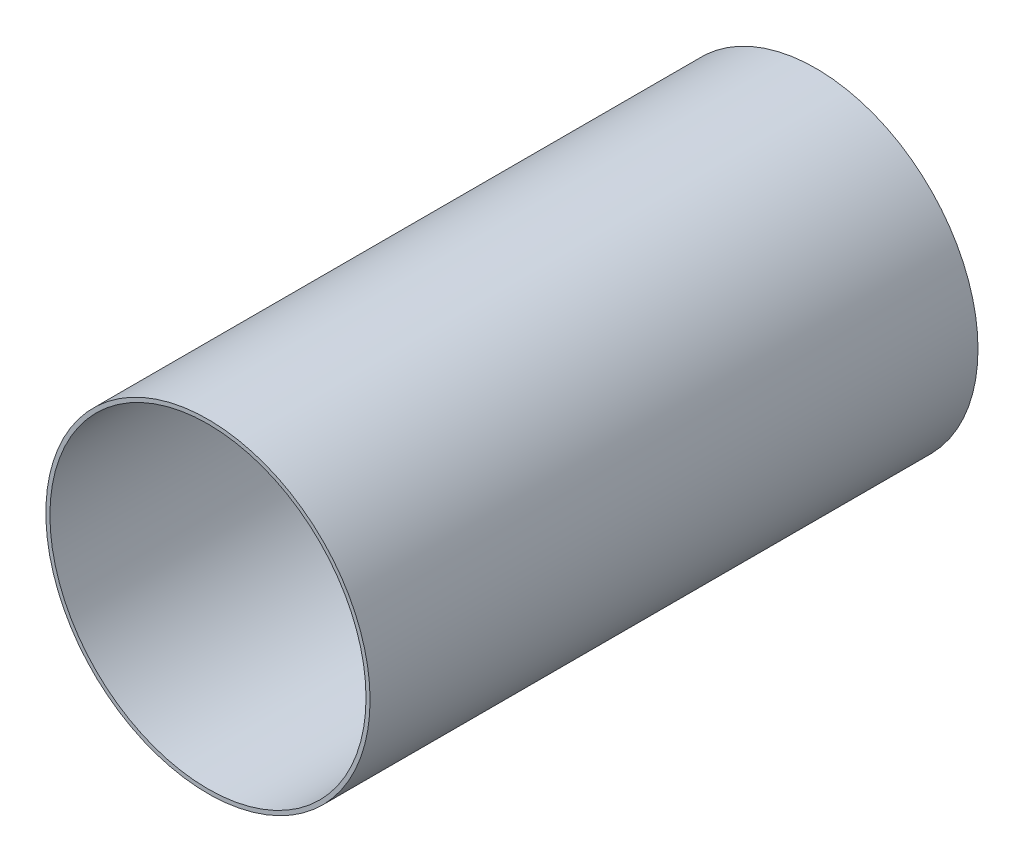
ISO-10303-21;
HEADER;
FILE_DESCRIPTION(('STEP AP214'),'2;1');
FILE_NAME('part.step','',(''),(''),'','','');
FILE_SCHEMA(('AUTOMOTIVE_DESIGN { 1 0 10303 214 1 1 1 1 }'));
ENDSEC;
DATA;
#1=APPLICATION_CONTEXT('core data for automotive mechanical design processes');
#2=APPLICATION_PROTOCOL_DEFINITION('international standard','automotive_design',2000,#1);
#3=PRODUCT_CONTEXT('',#1,'mechanical');
#4=PRODUCT('Part','Part','',(#3));
#5=PRODUCT_RELATED_PRODUCT_CATEGORY('part','',(#4));
#6=PRODUCT_DEFINITION_FORMATION('','',#4);
#7=PRODUCT_DEFINITION_CONTEXT('part definition',#1,'design');
#8=PRODUCT_DEFINITION('design','',#6,#7);
#9=PRODUCT_DEFINITION_SHAPE('','',#8);
#10=(LENGTH_UNIT() NAMED_UNIT(*) SI_UNIT(.MILLI.,.METRE.));
#11=(NAMED_UNIT(*) PLANE_ANGLE_UNIT() SI_UNIT($,.RADIAN.));
#12=(NAMED_UNIT(*) SI_UNIT($,.STERADIAN.) SOLID_ANGLE_UNIT());
#13=UNCERTAINTY_MEASURE_WITH_UNIT(LENGTH_MEASURE(1.E-05),#10,'distance_accuracy_value','');
#14=(GEOMETRIC_REPRESENTATION_CONTEXT(3) GLOBAL_UNCERTAINTY_ASSIGNED_CONTEXT((#13)) GLOBAL_UNIT_ASSIGNED_CONTEXT((#10,
#11,#12)) REPRESENTATION_CONTEXT('',''));
#15=CARTESIAN_POINT('',(0.,0.,0.));
#16=DIRECTION('',(0.,0.,1.));
#17=DIRECTION('',(1.,0.,0.));
#18=AXIS2_PLACEMENT_3D('',#15,#16,#17);
#19=CARTESIAN_POINT('',(0.,0.,300.));
#20=DIRECTION('',(0.,0.,1.));
#21=DIRECTION('',(1.,0.,0.));
#22=AXIS2_PLACEMENT_3D('',#19,#20,#21);
#23=PLANE('',#22);
#24=CARTESIAN_POINT('',(0.,0.,300.));
#25=DIRECTION('',(0.,0.,1.));
#26=DIRECTION('',(1.,0.,0.));
#27=AXIS2_PLACEMENT_3D('',#24,#25,#26);
#28=CIRCLE('',#27,80.);
#29=CARTESIAN_POINT('',(80.,0.,300.));
#30=VERTEX_POINT('',#29);
#31=EDGE_CURVE('E10',#30,#30,#28,.T.);
#32=ORIENTED_EDGE('',*,*,#31,.T.);
#33=EDGE_LOOP('',(#32));
#34=FACE_BOUND('',#33,.T.);
#35=CARTESIAN_POINT('',(0.,0.,300.));
#36=DIRECTION('',(0.,0.,1.));
#37=DIRECTION('',(1.,0.,0.));
#38=AXIS2_PLACEMENT_3D('',#35,#36,#37);
#39=CIRCLE('',#38,78.);
#40=CARTESIAN_POINT('',(78.,0.,300.));
#41=VERTEX_POINT('',#40);
#42=EDGE_CURVE('E41',#41,#41,#39,.T.);
#43=ORIENTED_EDGE('',*,*,#42,.F.);
#44=EDGE_LOOP('',(#43));
#45=FACE_BOUND('',#44,.T.);
#46=ADVANCED_FACE('F30',(#34,#45),#23,.T.);
#47=CARTESIAN_POINT('',(0.,0.,0.));
#48=DIRECTION('',(0.,0.,1.));
#49=DIRECTION('',(1.,0.,0.));
#50=AXIS2_PLACEMENT_3D('',#47,#48,#49);
#51=PLANE('',#50);
#52=CARTESIAN_POINT('',(0.,0.,0.));
#53=DIRECTION('',(0.,0.,1.));
#54=DIRECTION('',(1.,0.,0.));
#55=AXIS2_PLACEMENT_3D('',#52,#53,#54);
#56=CIRCLE('',#55,80.);
#57=CARTESIAN_POINT('',(80.,0.,0.));
#58=VERTEX_POINT('',#57);
#59=EDGE_CURVE('E34',#58,#58,#56,.T.);
#60=ORIENTED_EDGE('',*,*,#59,.F.);
#61=EDGE_LOOP('',(#60));
#62=FACE_BOUND('',#61,.T.);
#63=CARTESIAN_POINT('',(0.,0.,0.));
#64=DIRECTION('',(0.,0.,1.));
#65=DIRECTION('',(1.,0.,0.));
#66=AXIS2_PLACEMENT_3D('',#63,#64,#65);
#67=CIRCLE('',#66,78.);
#68=CARTESIAN_POINT('',(78.,0.,0.));
#69=VERTEX_POINT('',#68);
#70=EDGE_CURVE('E43',#69,#69,#67,.T.);
#71=ORIENTED_EDGE('',*,*,#70,.T.);
#72=EDGE_LOOP('',(#71));
#73=FACE_BOUND('',#72,.T.);
#74=ADVANCED_FACE('F53',(#62,#73),#51,.F.);
#75=CARTESIAN_POINT('',(0.,0.,300.));
#76=DIRECTION('',(0.,0.,-1.));
#77=DIRECTION('',(-1.,0.,0.));
#78=AXIS2_PLACEMENT_3D('',#75,#76,#77);
#79=CYLINDRICAL_SURFACE('',#78,80.);
#80=ORIENTED_EDGE('',*,*,#31,.F.);
#81=EDGE_LOOP('',(#80));
#82=FACE_BOUND('',#81,.T.);
#83=ORIENTED_EDGE('',*,*,#59,.T.);
#84=EDGE_LOOP('',(#83));
#85=FACE_BOUND('',#84,.T.);
#86=ADVANCED_FACE('F32',(#82,#85),#79,.T.);
#87=CARTESIAN_POINT('',(0.,0.,300.));
#88=DIRECTION('',(0.,0.,-1.));
#89=DIRECTION('',(-1.,0.,0.));
#90=AXIS2_PLACEMENT_3D('',#87,#88,#89);
#91=CYLINDRICAL_SURFACE('',#90,78.);
#92=ORIENTED_EDGE('',*,*,#42,.T.);
#93=EDGE_LOOP('',(#92));
#94=FACE_BOUND('',#93,.T.);
#95=ORIENTED_EDGE('',*,*,#70,.F.);
#96=EDGE_LOOP('',(#95));
#97=FACE_BOUND('',#96,.T.);
#98=ADVANCED_FACE('F49',(#94,#97),#91,.F.);
#99=CLOSED_SHELL('',(#46,#74,#86,#98));
#100=MANIFOLD_SOLID_BREP('B2',#99);
#101=ADVANCED_BREP_SHAPE_REPRESENTATION('',(#18,#100),#14);
#102=SHAPE_DEFINITION_REPRESENTATION(#9,#101);
ENDSEC;
END-ISO-10303-21;
